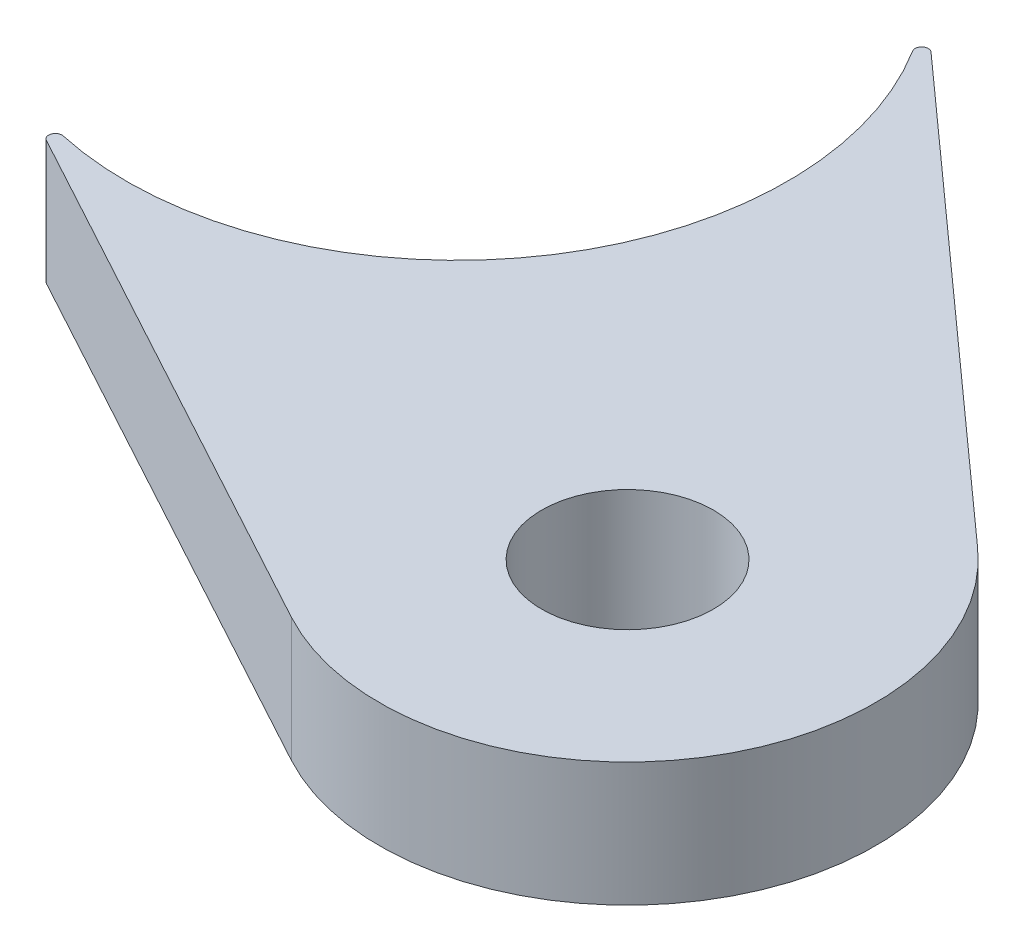
ISO-10303-21;
HEADER;
FILE_DESCRIPTION(('STEP AP214'),'2;1');
FILE_NAME('part.step','',(''),(''),'','','');
FILE_SCHEMA(('AUTOMOTIVE_DESIGN { 1 0 10303 214 1 1 1 1 }'));
ENDSEC;
DATA;
#1=APPLICATION_CONTEXT('core data for automotive mechanical design processes');
#2=APPLICATION_PROTOCOL_DEFINITION('international standard','automotive_design',2000,#1);
#3=PRODUCT_CONTEXT('',#1,'mechanical');
#4=PRODUCT('Part','Part','',(#3));
#5=PRODUCT_RELATED_PRODUCT_CATEGORY('part','',(#4));
#6=PRODUCT_DEFINITION_FORMATION('','',#4);
#7=PRODUCT_DEFINITION_CONTEXT('part definition',#1,'design');
#8=PRODUCT_DEFINITION('design','',#6,#7);
#9=PRODUCT_DEFINITION_SHAPE('','',#8);
#10=(LENGTH_UNIT() NAMED_UNIT(*) SI_UNIT(.MILLI.,.METRE.));
#11=(NAMED_UNIT(*) PLANE_ANGLE_UNIT() SI_UNIT($,.RADIAN.));
#12=(NAMED_UNIT(*) SI_UNIT($,.STERADIAN.) SOLID_ANGLE_UNIT());
#13=UNCERTAINTY_MEASURE_WITH_UNIT(LENGTH_MEASURE(1.E-05),#10,'distance_accuracy_value','');
#14=(GEOMETRIC_REPRESENTATION_CONTEXT(3) GLOBAL_UNCERTAINTY_ASSIGNED_CONTEXT((#13)) GLOBAL_UNIT_ASSIGNED_CONTEXT((#10,
#11,#12)) REPRESENTATION_CONTEXT('',''));
#15=CARTESIAN_POINT('',(0.,0.,0.));
#16=DIRECTION('',(0.,0.,1.));
#17=DIRECTION('',(1.,0.,0.));
#18=AXIS2_PLACEMENT_3D('',#15,#16,#17);
#19=CARTESIAN_POINT('',(22.2122120377583,4.7625,15.6608211914212));
#20=DIRECTION('',(0.,-1.,0.));
#21=DIRECTION('',(0.,0.,-1.));
#22=AXIS2_PLACEMENT_3D('',#19,#20,#21);
#23=PLANE('',#22);
#24=DIRECTION('',(-0.744373603394552,0.,-0.667763385166789));
#25=VECTOR('',#24,1.);
#26=CARTESIAN_POINT('',(28.5726582814719,4.7625,8.57066261908808));
#27=LINE('',#26,#25);
#28=CARTESIAN_POINT('',(28.5726582814719,4.7625,8.57066261908808));
#29=VERTEX_POINT('',#28);
#30=CARTESIAN_POINT('',(11.1544612349167,4.7625,-7.05487027228286));
#31=VERTEX_POINT('',#30);
#32=EDGE_CURVE('E86',#29,#31,#27,.T.);
#33=ORIENTED_EDGE('',*,*,#32,.T.);
#34=CARTESIAN_POINT('',(10.9848493350843,4.7625,-6.86579937702064));
#35=DIRECTION('',(0.,-1.,0.));
#36=DIRECTION('',(0.,0.,-1.));
#37=AXIS2_PLACEMENT_3D('',#34,#35,#36);
#38=CIRCLE('',#37,0.254);
#39=CARTESIAN_POINT('',(10.7694601324356,4.7625,-6.73117585982416));
#40=VERTEX_POINT('',#39);
#41=EDGE_CURVE('E41',#31,#40,#38,.F.);
#42=ORIENTED_EDGE('',*,*,#41,.T.);
#43=CARTESIAN_POINT('',(0.,4.7625,0.));
#44=DIRECTION('',(0.,-1.,0.));
#45=DIRECTION('',(0.,0.,1.));
#46=AXIS2_PLACEMENT_3D('',#43,#44,#45);
#47=CIRCLE('',#46,12.7);
#48=CARTESIAN_POINT('',(-2.72242756199069,4.7625,12.4047727979884));
#49=VERTEX_POINT('',#48);
#50=EDGE_CURVE('E93',#40,#49,#47,.T.);
#51=ORIENTED_EDGE('',*,*,#50,.T.);
#52=CARTESIAN_POINT('',(-2.77687611323051,4.7625,12.6528682539482));
#53=DIRECTION('',(0.,-1.,0.));
#54=DIRECTION('',(0.,0.,-1.));
#55=AXIS2_PLACEMENT_3D('',#52,#53,#54);
#56=CIRCLE('',#55,0.254);
#57=CARTESIAN_POINT('',(-2.89798549747688,4.7625,12.8761360685733));
#58=VERTEX_POINT('',#57);
#59=EDGE_CURVE('E48',#49,#58,#56,.F.);
#60=ORIENTED_EDGE('',*,*,#59,.T.);
#61=DIRECTION('',(0.879007144193264,0.,0.47680859939519));
#62=VECTOR('',#61,1.);
#63=CARTESIAN_POINT('',(17.6706101285191,4.7625,24.033364239862));
#64=LINE('',#63,#62);
#65=CARTESIAN_POINT('',(17.6706101285191,4.7625,24.033364239862));
#66=VERTEX_POINT('',#65);
#67=EDGE_CURVE('E98',#58,#66,#64,.T.);
#68=ORIENTED_EDGE('',*,*,#67,.T.);
#69=CARTESIAN_POINT('',(22.2122120377583,4.7625,15.6608211914212));
#70=DIRECTION('',(0.,1.,0.));
#71=DIRECTION('',(0.,0.,-1.));
#72=AXIS2_PLACEMENT_3D('',#69,#70,#71);
#73=CIRCLE('',#72,9.525);
#74=EDGE_CURVE('E94',#66,#29,#73,.T.);
#75=ORIENTED_EDGE('',*,*,#74,.T.);
#76=EDGE_LOOP('',(#33,#42,#51,#60,#68,#75));
#77=FACE_BOUND('',#76,.T.);
#78=CARTESIAN_POINT('',(22.2122120377582,4.7625,15.6608211914212));
#79=DIRECTION('',(0.,1.,0.));
#80=DIRECTION('',(0.,0.,1.));
#81=AXIS2_PLACEMENT_3D('',#78,#79,#80);
#82=CIRCLE('',#81,3.29999999999998);
#83=CARTESIAN_POINT('',(22.2122120377582,4.7625,12.3608211914212));
#84=VERTEX_POINT('',#83);
#85=EDGE_CURVE('E139',#84,#84,#82,.T.);
#86=ORIENTED_EDGE('',*,*,#85,.F.);
#87=EDGE_LOOP('',(#86));
#88=FACE_BOUND('',#87,.T.);
#89=ADVANCED_FACE('F33',(#77,#88),#23,.F.);
#90=CARTESIAN_POINT('',(22.2122120377583,0.,15.6608211914212));
#91=DIRECTION('',(0.,-1.,0.));
#92=DIRECTION('',(0.,0.,-1.));
#93=AXIS2_PLACEMENT_3D('',#90,#91,#92);
#94=PLANE('',#93);
#95=CARTESIAN_POINT('',(0.,0.,0.));
#96=DIRECTION('',(0.,-1.,0.));
#97=DIRECTION('',(0.,0.,1.));
#98=AXIS2_PLACEMENT_3D('',#95,#96,#97);
#99=CIRCLE('',#98,12.7);
#100=CARTESIAN_POINT('',(10.7694601324356,0.,-6.73117585982416));
#101=VERTEX_POINT('',#100);
#102=CARTESIAN_POINT('',(-2.72242756199069,0.,12.4047727979884));
#103=VERTEX_POINT('',#102);
#104=EDGE_CURVE('E136',#101,#103,#99,.T.);
#105=ORIENTED_EDGE('',*,*,#104,.F.);
#106=CARTESIAN_POINT('',(10.9848493350843,0.,-6.86579937702064));
#107=DIRECTION('',(0.,-1.,0.));
#108=DIRECTION('',(0.,0.,-1.));
#109=AXIS2_PLACEMENT_3D('',#106,#107,#108);
#110=CIRCLE('',#109,0.254);
#111=CARTESIAN_POINT('',(11.1544612349167,0.,-7.05487027228286));
#112=VERTEX_POINT('',#111);
#113=EDGE_CURVE('E119',#101,#112,#110,.T.);
#114=ORIENTED_EDGE('',*,*,#113,.T.);
#115=DIRECTION('',(-0.744373603394552,0.,-0.667763385166789));
#116=VECTOR('',#115,1.);
#117=CARTESIAN_POINT('',(28.5726582814719,0.,8.57066261908808));
#118=LINE('',#117,#116);
#119=CARTESIAN_POINT('',(28.5726582814719,0.,8.57066261908808));
#120=VERTEX_POINT('',#119);
#121=EDGE_CURVE('E135',#120,#112,#118,.T.);
#122=ORIENTED_EDGE('',*,*,#121,.F.);
#123=CARTESIAN_POINT('',(22.2122120377583,0.,15.6608211914212));
#124=DIRECTION('',(0.,1.,0.));
#125=DIRECTION('',(0.,0.,-1.));
#126=AXIS2_PLACEMENT_3D('',#123,#124,#125);
#127=CIRCLE('',#126,9.525);
#128=CARTESIAN_POINT('',(17.6706101285191,0.,24.033364239862));
#129=VERTEX_POINT('',#128);
#130=EDGE_CURVE('E106',#129,#120,#127,.T.);
#131=ORIENTED_EDGE('',*,*,#130,.F.);
#132=DIRECTION('',(0.879007144193264,0.,0.47680859939519));
#133=VECTOR('',#132,1.);
#134=CARTESIAN_POINT('',(17.6706101285191,0.,24.033364239862));
#135=LINE('',#134,#133);
#136=CARTESIAN_POINT('',(-2.89798549747688,0.,12.8761360685733));
#137=VERTEX_POINT('',#136);
#138=EDGE_CURVE('E102',#137,#129,#135,.T.);
#139=ORIENTED_EDGE('',*,*,#138,.F.);
#140=CARTESIAN_POINT('',(-2.77687611323051,0.,12.6528682539482));
#141=DIRECTION('',(0.,-1.,0.));
#142=DIRECTION('',(0.,0.,-1.));
#143=AXIS2_PLACEMENT_3D('',#140,#141,#142);
#144=CIRCLE('',#143,0.254);
#145=EDGE_CURVE('E117',#137,#103,#144,.T.);
#146=ORIENTED_EDGE('',*,*,#145,.T.);
#147=EDGE_LOOP('',(#105,#114,#122,#131,#139,#146));
#148=FACE_BOUND('',#147,.T.);
#149=CARTESIAN_POINT('',(22.2122120377582,0.,15.6608211914212));
#150=DIRECTION('',(0.,1.,0.));
#151=DIRECTION('',(0.,0.,1.));
#152=AXIS2_PLACEMENT_3D('',#149,#150,#151);
#153=CIRCLE('',#152,3.29999999999998);
#154=CARTESIAN_POINT('',(22.2122120377582,0.,12.3608211914212));
#155=VERTEX_POINT('',#154);
#156=EDGE_CURVE('E224',#155,#155,#153,.T.);
#157=ORIENTED_EDGE('',*,*,#156,.T.);
#158=EDGE_LOOP('',(#157));
#159=FACE_BOUND('',#158,.T.);
#160=ADVANCED_FACE('F133',(#148,#159),#94,.T.);
#161=CARTESIAN_POINT('',(22.2122120377583,4.7625,15.6608211914212));
#162=DIRECTION('',(0.,-1.,0.));
#163=DIRECTION('',(0.,0.,-1.));
#164=AXIS2_PLACEMENT_3D('',#161,#162,#163);
#165=CYLINDRICAL_SURFACE('',#164,9.525);
#166=ORIENTED_EDGE('',*,*,#130,.T.);
#167=DIRECTION('',(0.,-1.,0.));
#168=VECTOR('',#167,1.);
#169=CARTESIAN_POINT('',(28.5726582814719,4.7625,8.57066261908808));
#170=LINE('',#169,#168);
#171=EDGE_CURVE('E90',#29,#120,#170,.T.);
#172=ORIENTED_EDGE('',*,*,#171,.F.);
#173=ORIENTED_EDGE('',*,*,#74,.F.);
#174=DIRECTION('',(0.,-1.,0.));
#175=VECTOR('',#174,1.);
#176=CARTESIAN_POINT('',(17.6706101285191,4.7625,24.033364239862));
#177=LINE('',#176,#175);
#178=EDGE_CURVE('E108',#66,#129,#177,.T.);
#179=ORIENTED_EDGE('',*,*,#178,.T.);
#180=EDGE_LOOP('',(#166,#172,#173,#179));
#181=FACE_BOUND('',#180,.T.);
#182=ADVANCED_FACE('F104',(#181),#165,.T.);
#183=CARTESIAN_POINT('',(28.5726582814719,4.7625,8.57066261908808));
#184=DIRECTION('',(-0.667763385166789,0.,0.744373603394552));
#185=DIRECTION('',(0.744373603394552,0.,0.667763385166789));
#186=AXIS2_PLACEMENT_3D('',#183,#184,#185);
#187=PLANE('',#186);
#188=ORIENTED_EDGE('',*,*,#121,.T.);
#189=DIRECTION('',(0.,-1.,0.));
#190=VECTOR('',#189,1.);
#191=CARTESIAN_POINT('',(11.1544612349167,4.7625,-7.05487027228285));
#192=LINE('',#191,#190);
#193=EDGE_CURVE('E56',#112,#31,#192,.F.);
#194=ORIENTED_EDGE('',*,*,#193,.T.);
#195=ORIENTED_EDGE('',*,*,#32,.F.);
#196=ORIENTED_EDGE('',*,*,#171,.T.);
#197=EDGE_LOOP('',(#188,#194,#195,#196));
#198=FACE_BOUND('',#197,.T.);
#199=ADVANCED_FACE('F88',(#198),#187,.F.);
#200=CARTESIAN_POINT('',(0.,4.7625,0.));
#201=DIRECTION('',(0.,-1.,0.));
#202=DIRECTION('',(0.,0.,-1.));
#203=AXIS2_PLACEMENT_3D('',#200,#201,#202);
#204=CYLINDRICAL_SURFACE('',#203,12.7);
#205=ORIENTED_EDGE('',*,*,#50,.F.);
#206=DIRECTION('',(0.,-1.,0.));
#207=VECTOR('',#206,1.);
#208=CARTESIAN_POINT('',(10.7694601324356,4.7625,-6.73117585982415));
#209=LINE('',#208,#207);
#210=EDGE_CURVE('E110',#40,#101,#209,.T.);
#211=ORIENTED_EDGE('',*,*,#210,.T.);
#212=ORIENTED_EDGE('',*,*,#104,.T.);
#213=DIRECTION('',(0.,-1.,0.));
#214=VECTOR('',#213,1.);
#215=CARTESIAN_POINT('',(-2.72242756199069,4.7625,12.4047727979884));
#216=LINE('',#215,#214);
#217=EDGE_CURVE('E107',#103,#49,#216,.F.);
#218=ORIENTED_EDGE('',*,*,#217,.T.);
#219=EDGE_LOOP('',(#205,#211,#212,#218));
#220=FACE_BOUND('',#219,.T.);
#221=ADVANCED_FACE('F126',(#220),#204,.F.);
#222=CARTESIAN_POINT('',(17.6706101285191,4.7625,24.033364239862));
#223=DIRECTION('',(0.47680859939519,0.,-0.879007144193264));
#224=DIRECTION('',(-0.879007144193264,0.,-0.47680859939519));
#225=AXIS2_PLACEMENT_3D('',#222,#223,#224);
#226=PLANE('',#225);
#227=ORIENTED_EDGE('',*,*,#67,.F.);
#228=DIRECTION('',(0.,-1.,0.));
#229=VECTOR('',#228,1.);
#230=CARTESIAN_POINT('',(-2.89798549747689,4.7625,12.8761360685733));
#231=LINE('',#230,#229);
#232=EDGE_CURVE('E11',#58,#137,#231,.T.);
#233=ORIENTED_EDGE('',*,*,#232,.T.);
#234=ORIENTED_EDGE('',*,*,#138,.T.);
#235=ORIENTED_EDGE('',*,*,#178,.F.);
#236=EDGE_LOOP('',(#227,#233,#234,#235));
#237=FACE_BOUND('',#236,.T.);
#238=ADVANCED_FACE('F144',(#237),#226,.F.);
#239=CARTESIAN_POINT('',(22.2122120377582,4.7625,15.6608211914212));
#240=DIRECTION('',(0.,-1.,0.));
#241=DIRECTION('',(0.,0.,-1.));
#242=AXIS2_PLACEMENT_3D('',#239,#240,#241);
#243=CYLINDRICAL_SURFACE('',#242,3.29999999999998);
#244=CARTESIAN_POINT('',(22.2122120377582,4.7625,12.3608211914212));
#245=CARTESIAN_POINT('',(22.2122120377582,4.712890625,12.3608211914212));
#246=CARTESIAN_POINT('',(22.2122120377582,4.66328125,12.3608211914212));
#247=CARTESIAN_POINT('',(22.2122120377582,4.5640625,12.3608211914212));
#248=CARTESIAN_POINT('',(22.2122120377582,4.514453125,12.3608211914212));
#249=CARTESIAN_POINT('',(22.2122120377582,4.415234375,12.3608211914212));
#250=CARTESIAN_POINT('',(22.2122120377582,4.365625,12.3608211914212));
#251=CARTESIAN_POINT('',(22.2122120377582,4.26640625,12.3608211914212));
#252=CARTESIAN_POINT('',(22.2122120377582,4.216796875,12.3608211914212));
#253=CARTESIAN_POINT('',(22.2122120377582,4.117578125,12.3608211914212));
#254=CARTESIAN_POINT('',(22.2122120377582,4.06796875,12.3608211914212));
#255=CARTESIAN_POINT('',(22.2122120377582,3.96875,12.3608211914212));
#256=CARTESIAN_POINT('',(22.2122120377582,3.919140625,12.3608211914212));
#257=CARTESIAN_POINT('',(22.2122120377582,3.819921875,12.3608211914212));
#258=CARTESIAN_POINT('',(22.2122120377582,3.7703125,12.3608211914212));
#259=CARTESIAN_POINT('',(22.2122120377582,3.67109375,12.3608211914212));
#260=CARTESIAN_POINT('',(22.2122120377582,3.621484375,12.3608211914212));
#261=CARTESIAN_POINT('',(22.2122120377582,3.522265625,12.3608211914212));
#262=CARTESIAN_POINT('',(22.2122120377582,3.47265625,12.3608211914212));
#263=CARTESIAN_POINT('',(22.2122120377582,3.3734375,12.3608211914212));
#264=CARTESIAN_POINT('',(22.2122120377582,3.323828125,12.3608211914212));
#265=CARTESIAN_POINT('',(22.2122120377582,3.224609375,12.3608211914212));
#266=CARTESIAN_POINT('',(22.2122120377582,3.175,12.3608211914212));
#267=CARTESIAN_POINT('',(22.2122120377582,3.07578125,12.3608211914212));
#268=CARTESIAN_POINT('',(22.2122120377582,3.026171875,12.3608211914212));
#269=CARTESIAN_POINT('',(22.2122120377582,2.926953125,12.3608211914212));
#270=CARTESIAN_POINT('',(22.2122120377582,2.87734375,12.3608211914212));
#271=CARTESIAN_POINT('',(22.2122120377582,2.778125,12.3608211914212));
#272=CARTESIAN_POINT('',(22.2122120377582,2.728515625,12.3608211914212));
#273=CARTESIAN_POINT('',(22.2122120377582,2.629296875,12.3608211914212));
#274=CARTESIAN_POINT('',(22.2122120377582,2.5796875,12.3608211914212));
#275=CARTESIAN_POINT('',(22.2122120377582,2.48046875,12.3608211914212));
#276=CARTESIAN_POINT('',(22.2122120377582,2.430859375,12.3608211914212));
#277=CARTESIAN_POINT('',(22.2122120377582,2.331640625,12.3608211914212));
#278=CARTESIAN_POINT('',(22.2122120377582,2.28203125,12.3608211914212));
#279=CARTESIAN_POINT('',(22.2122120377582,2.1828125,12.3608211914212));
#280=CARTESIAN_POINT('',(22.2122120377582,2.133203125,12.3608211914212));
#281=CARTESIAN_POINT('',(22.2122120377582,2.033984375,12.3608211914212));
#282=CARTESIAN_POINT('',(22.2122120377582,1.984375,12.3608211914212));
#283=CARTESIAN_POINT('',(22.2122120377582,1.88515625,12.3608211914212));
#284=CARTESIAN_POINT('',(22.2122120377582,1.835546875,12.3608211914212));
#285=CARTESIAN_POINT('',(22.2122120377582,1.736328125,12.3608211914212));
#286=CARTESIAN_POINT('',(22.2122120377582,1.68671875,12.3608211914212));
#287=CARTESIAN_POINT('',(22.2122120377582,1.5875,12.3608211914212));
#288=CARTESIAN_POINT('',(22.2122120377582,1.537890625,12.3608211914212));
#289=CARTESIAN_POINT('',(22.2122120377582,1.438671875,12.3608211914212));
#290=CARTESIAN_POINT('',(22.2122120377582,1.3890625,12.3608211914212));
#291=CARTESIAN_POINT('',(22.2122120377582,1.28984375,12.3608211914212));
#292=CARTESIAN_POINT('',(22.2122120377582,1.240234375,12.3608211914212));
#293=CARTESIAN_POINT('',(22.2122120377582,1.141015625,12.3608211914212));
#294=CARTESIAN_POINT('',(22.2122120377582,1.09140625,12.3608211914212));
#295=CARTESIAN_POINT('',(22.2122120377582,0.992187499999999,12.3608211914212));
#296=CARTESIAN_POINT('',(22.2122120377582,0.942578124999999,12.3608211914212));
#297=CARTESIAN_POINT('',(22.2122120377582,0.843359375,12.3608211914212));
#298=CARTESIAN_POINT('',(22.2122120377582,0.79375,12.3608211914212));
#299=CARTESIAN_POINT('',(22.2122120377582,0.69453125,12.3608211914212));
#300=CARTESIAN_POINT('',(22.2122120377582,0.644921875,12.3608211914212));
#301=CARTESIAN_POINT('',(22.2122120377582,0.545703125,12.3608211914212));
#302=CARTESIAN_POINT('',(22.2122120377582,0.49609375,12.3608211914212));
#303=CARTESIAN_POINT('',(22.2122120377582,0.396875,12.3608211914212));
#304=CARTESIAN_POINT('',(22.2122120377582,0.347265625,12.3608211914212));
#305=CARTESIAN_POINT('',(22.2122120377582,0.248046875,12.3608211914212));
#306=CARTESIAN_POINT('',(22.2122120377582,0.1984375,12.3608211914212));
#307=CARTESIAN_POINT('',(22.2122120377582,0.09921875,12.3608211914212));
#308=CARTESIAN_POINT('',(22.2122120377582,0.049609375,12.3608211914212));
#309=CARTESIAN_POINT('',(22.2122120377582,0.,12.3608211914212));
#310=B_SPLINE_CURVE_WITH_KNOTS('',3,(#244,#245,#246,#247,#248,#249,#250,#251,#252,#253,#254,
#255,#256,#257,#258,#259,#260,#261,#262,#263,#264,#265,#266,#267,#268,#269,#270,#271,#272,#273,
#274,#275,#276,#277,#278,#279,#280,#281,#282,#283,#284,#285,#286,#287,#288,#289,#290,#291,#292,
#293,#294,#295,#296,#297,#298,#299,#300,#301,#302,#303,#304,#305,#306,#307,#308,#309),
.UNSPECIFIED.,.F.,.F.,(4,2,2,2,2,2,2,2,2,2,2,2,2,2,2,2,2,2,2,2,2,2,2,2,2,2,2,2,2,2,2,2,4),(0.,
0.148828125,0.29765625,0.446484375,0.5953125,0.744140625,0.892968750000001,1.041796875,1.190625,
1.339453125,1.48828125,1.637109375,1.7859375,1.934765625,2.08359375,2.232421875,2.38125,
2.530078125,2.67890625,2.827734375,2.9765625,3.125390625,3.27421875,3.423046875,3.571875,
3.720703125,3.86953125,4.018359375,4.1671875,4.316015625,4.46484375,4.613671875,4.7625),.UNSPECIFIED.);
#311=EDGE_CURVE('BSEAM151',#84,#155,#310,.T.);
#312=ORIENTED_EDGE('',*,*,#85,.T.);
#313=ORIENTED_EDGE('',*,*,#156,.F.);
#314=ORIENTED_EDGE('',*,*,#311,.T.);
#315=ORIENTED_EDGE('',*,*,#311,.F.);
#316=EDGE_LOOP('',(#312,#314,#313,#315));
#317=FACE_BOUND('',#316,.T.);
#318=ADVANCED_FACE('F151',(#317),#243,.F.);
#319=CARTESIAN_POINT('',(10.9848493350843,4.7625,-6.86579937702064));
#320=DIRECTION('',(0.,-1.,0.));
#321=DIRECTION('',(0.,0.,-1.));
#322=AXIS2_PLACEMENT_3D('',#319,#320,#321);
#323=CYLINDRICAL_SURFACE('',#322,0.254);
#324=ORIENTED_EDGE('',*,*,#41,.F.);
#325=ORIENTED_EDGE('',*,*,#193,.F.);
#326=ORIENTED_EDGE('',*,*,#113,.F.);
#327=ORIENTED_EDGE('',*,*,#210,.F.);
#328=EDGE_LOOP('',(#324,#325,#326,#327));
#329=FACE_BOUND('',#328,.T.);
#330=ADVANCED_FACE('F131',(#329),#323,.T.);
#331=CARTESIAN_POINT('',(-2.77687611323051,4.7625,12.6528682539482));
#332=DIRECTION('',(0.,-1.,0.));
#333=DIRECTION('',(0.,0.,-1.));
#334=AXIS2_PLACEMENT_3D('',#331,#332,#333);
#335=CYLINDRICAL_SURFACE('',#334,0.254);
#336=ORIENTED_EDGE('',*,*,#59,.F.);
#337=ORIENTED_EDGE('',*,*,#217,.F.);
#338=ORIENTED_EDGE('',*,*,#145,.F.);
#339=ORIENTED_EDGE('',*,*,#232,.F.);
#340=EDGE_LOOP('',(#336,#337,#338,#339));
#341=FACE_BOUND('',#340,.T.);
#342=ADVANCED_FACE('F35',(#341),#335,.T.);
#343=CLOSED_SHELL('',(#89,#160,#182,#199,#221,#238,#318,#330,#342));
#344=MANIFOLD_SOLID_BREP('B2',#343);
#345=ADVANCED_BREP_SHAPE_REPRESENTATION('',(#18,#344),#14);
#346=SHAPE_DEFINITION_REPRESENTATION(#9,#345);
ENDSEC;
END-ISO-10303-21;
